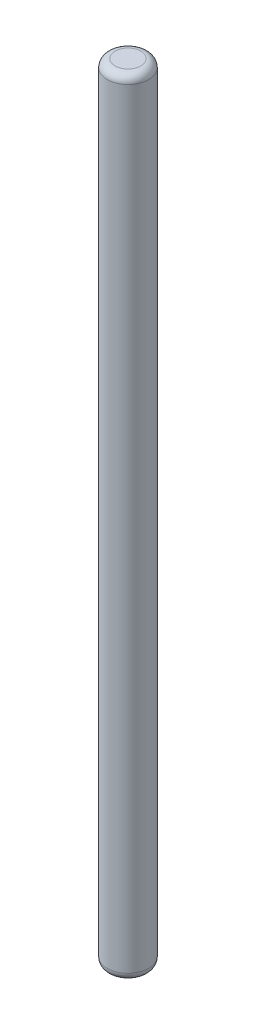
ISO-10303-21;
HEADER;
FILE_DESCRIPTION(('STEP AP214'),'2;1');
FILE_NAME('part.step','',(''),(''),'','','');
FILE_SCHEMA(('AUTOMOTIVE_DESIGN { 1 0 10303 214 1 1 1 1 }'));
ENDSEC;
DATA;
#1=APPLICATION_CONTEXT('core data for automotive mechanical design processes');
#2=APPLICATION_PROTOCOL_DEFINITION('international standard','automotive_design',2000,#1);
#3=PRODUCT_CONTEXT('',#1,'mechanical');
#4=PRODUCT('Part','Part','',(#3));
#5=PRODUCT_RELATED_PRODUCT_CATEGORY('part','',(#4));
#6=PRODUCT_DEFINITION_FORMATION('','',#4);
#7=PRODUCT_DEFINITION_CONTEXT('part definition',#1,'design');
#8=PRODUCT_DEFINITION('design','',#6,#7);
#9=PRODUCT_DEFINITION_SHAPE('','',#8);
#10=(LENGTH_UNIT() NAMED_UNIT(*) SI_UNIT(.MILLI.,.METRE.));
#11=(NAMED_UNIT(*) PLANE_ANGLE_UNIT() SI_UNIT($,.RADIAN.));
#12=(NAMED_UNIT(*) SI_UNIT($,.STERADIAN.) SOLID_ANGLE_UNIT());
#13=UNCERTAINTY_MEASURE_WITH_UNIT(LENGTH_MEASURE(1.E-05),#10,'distance_accuracy_value','');
#14=(GEOMETRIC_REPRESENTATION_CONTEXT(3) GLOBAL_UNCERTAINTY_ASSIGNED_CONTEXT((#13)) GLOBAL_UNIT_ASSIGNED_CONTEXT((#10,
#11,#12)) REPRESENTATION_CONTEXT('',''));
#15=CARTESIAN_POINT('',(0.,0.,0.));
#16=DIRECTION('',(0.,0.,1.));
#17=DIRECTION('',(1.,0.,0.));
#18=AXIS2_PLACEMENT_3D('',#15,#16,#17);
#19=CARTESIAN_POINT('',(0.,37.9984,0.));
#20=DIRECTION('',(0.,-1.,0.));
#21=DIRECTION('',(0.,0.,-1.));
#22=AXIS2_PLACEMENT_3D('',#19,#20,#21);
#23=CYLINDRICAL_SURFACE('',#22,1.0033);
#24=CARTESIAN_POINT('',(0.,0.380999999999999,0.));
#25=DIRECTION('',(0.,1.,0.));
#26=DIRECTION('',(0.,0.,1.));
#27=AXIS2_PLACEMENT_3D('',#24,#25,#26);
#28=CIRCLE('',#27,1.0033);
#29=CARTESIAN_POINT('',(0.,0.380999999999999,1.0033));
#30=VERTEX_POINT('',#29);
#31=EDGE_CURVE('E41',#30,#30,#28,.T.);
#32=ORIENTED_EDGE('',*,*,#31,.T.);
#33=EDGE_LOOP('',(#32));
#34=FACE_BOUND('',#33,.T.);
#35=CARTESIAN_POINT('',(0.,37.6174,0.));
#36=DIRECTION('',(0.,1.,0.));
#37=DIRECTION('',(0.,0.,1.));
#38=AXIS2_PLACEMENT_3D('',#35,#36,#37);
#39=CIRCLE('',#38,1.0033);
#40=CARTESIAN_POINT('',(0.,37.6174,1.0033));
#41=VERTEX_POINT('',#40);
#42=EDGE_CURVE('E45',#41,#41,#39,.F.);
#43=ORIENTED_EDGE('',*,*,#42,.T.);
#44=EDGE_LOOP('',(#43));
#45=FACE_BOUND('',#44,.T.);
#46=ADVANCED_FACE('F30',(#34,#45),#23,.T.);
#47=CARTESIAN_POINT('',(0.,37.9984,0.));
#48=DIRECTION('',(0.,1.,0.));
#49=DIRECTION('',(0.,0.,1.));
#50=AXIS2_PLACEMENT_3D('',#47,#48,#49);
#51=PLANE('',#50);
#52=CARTESIAN_POINT('',(0.,37.9984,0.));
#53=DIRECTION('',(0.,1.,0.));
#54=DIRECTION('',(0.,0.,1.));
#55=AXIS2_PLACEMENT_3D('',#52,#53,#54);
#56=CIRCLE('',#55,0.6223);
#57=CARTESIAN_POINT('',(0.,37.9984,0.6223));
#58=VERTEX_POINT('',#57);
#59=EDGE_CURVE('E10',#58,#58,#56,.T.);
#60=ORIENTED_EDGE('',*,*,#59,.T.);
#61=EDGE_LOOP('',(#60));
#62=FACE_BOUND('',#61,.T.);
#63=ADVANCED_FACE('F61',(#62),#51,.T.);
#64=CARTESIAN_POINT('',(0.,0.,0.));
#65=DIRECTION('',(0.,1.,0.));
#66=DIRECTION('',(0.,0.,1.));
#67=AXIS2_PLACEMENT_3D('',#64,#65,#66);
#68=PLANE('',#67);
#69=CARTESIAN_POINT('',(0.,0.,0.));
#70=DIRECTION('',(0.,1.,0.));
#71=DIRECTION('',(0.,0.,1.));
#72=AXIS2_PLACEMENT_3D('',#69,#70,#71);
#73=CIRCLE('',#72,0.6223);
#74=CARTESIAN_POINT('',(0.,0.,0.6223));
#75=VERTEX_POINT('',#74);
#76=EDGE_CURVE('E37',#75,#75,#73,.F.);
#77=ORIENTED_EDGE('',*,*,#76,.T.);
#78=EDGE_LOOP('',(#77));
#79=FACE_BOUND('',#78,.T.);
#80=ADVANCED_FACE('F58',(#79),#68,.F.);
#81=CARTESIAN_POINT('',(0.,0.380999999999999,0.));
#82=DIRECTION('',(0.,1.,0.));
#83=DIRECTION('',(0.,0.,1.));
#84=AXIS2_PLACEMENT_3D('',#81,#82,#83);
#85=TOROIDAL_SURFACE('',#84,0.6223,0.381);
#86=ORIENTED_EDGE('',*,*,#76,.F.);
#87=EDGE_LOOP('',(#86));
#88=FACE_BOUND('',#87,.T.);
#89=ORIENTED_EDGE('',*,*,#31,.F.);
#90=EDGE_LOOP('',(#89));
#91=FACE_BOUND('',#90,.T.);
#92=ADVANCED_FACE('F54',(#88,#91),#85,.T.);
#93=CARTESIAN_POINT('',(0.,37.6174,0.));
#94=DIRECTION('',(0.,1.,0.));
#95=DIRECTION('',(0.,0.,1.));
#96=AXIS2_PLACEMENT_3D('',#93,#94,#95);
#97=TOROIDAL_SURFACE('',#96,0.6223,0.381);
#98=ORIENTED_EDGE('',*,*,#42,.F.);
#99=EDGE_LOOP('',(#98));
#100=FACE_BOUND('',#99,.T.);
#101=ORIENTED_EDGE('',*,*,#59,.F.);
#102=EDGE_LOOP('',(#101));
#103=FACE_BOUND('',#102,.T.);
#104=ADVANCED_FACE('F32',(#100,#103),#97,.T.);
#105=CLOSED_SHELL('',(#46,#63,#80,#92,#104));
#106=MANIFOLD_SOLID_BREP('B2',#105);
#107=ADVANCED_BREP_SHAPE_REPRESENTATION('',(#18,#106),#14);
#108=SHAPE_DEFINITION_REPRESENTATION(#9,#107);
ENDSEC;
END-ISO-10303-21;
